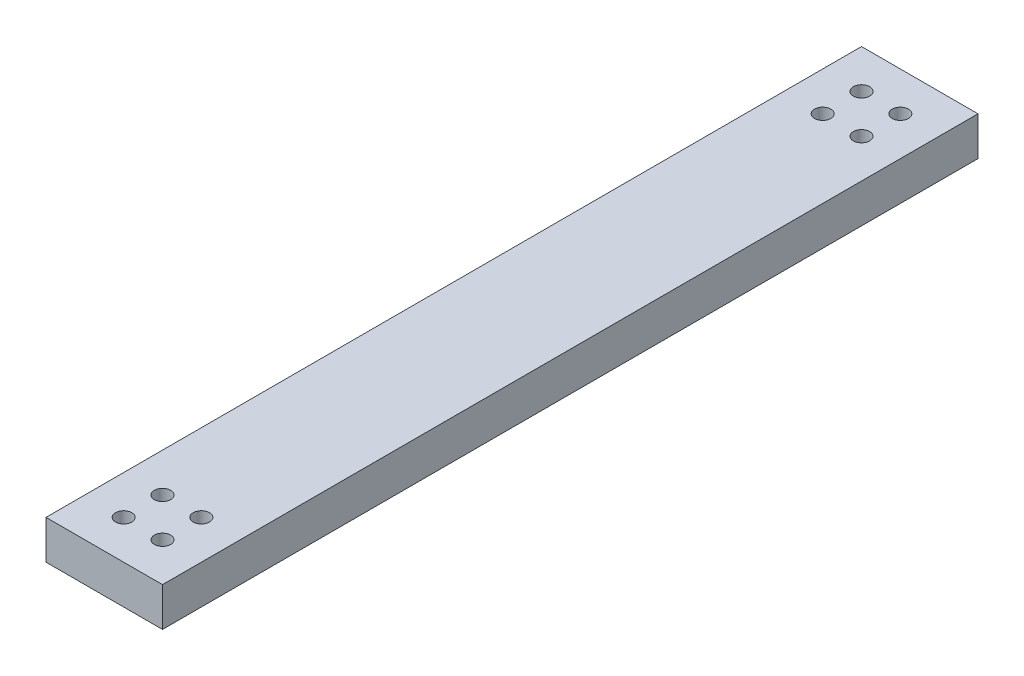
ISO-10303-21;
HEADER;
FILE_DESCRIPTION(('STEP AP214'),'2;1');
FILE_NAME('part.step','',(''),(''),'','','');
FILE_SCHEMA(('AUTOMOTIVE_DESIGN { 1 0 10303 214 1 1 1 1 }'));
ENDSEC;
DATA;
#1=APPLICATION_CONTEXT('core data for automotive mechanical design processes');
#2=APPLICATION_PROTOCOL_DEFINITION('international standard','automotive_design',2000,#1);
#3=PRODUCT_CONTEXT('',#1,'mechanical');
#4=PRODUCT('Part','Part','',(#3));
#5=PRODUCT_RELATED_PRODUCT_CATEGORY('part','',(#4));
#6=PRODUCT_DEFINITION_FORMATION('','',#4);
#7=PRODUCT_DEFINITION_CONTEXT('part definition',#1,'design');
#8=PRODUCT_DEFINITION('design','',#6,#7);
#9=PRODUCT_DEFINITION_SHAPE('','',#8);
#10=(LENGTH_UNIT() NAMED_UNIT(*) SI_UNIT(.MILLI.,.METRE.));
#11=(NAMED_UNIT(*) PLANE_ANGLE_UNIT() SI_UNIT($,.RADIAN.));
#12=(NAMED_UNIT(*) SI_UNIT($,.STERADIAN.) SOLID_ANGLE_UNIT());
#13=UNCERTAINTY_MEASURE_WITH_UNIT(LENGTH_MEASURE(1.E-05),#10,'distance_accuracy_value','');
#14=(GEOMETRIC_REPRESENTATION_CONTEXT(3) GLOBAL_UNCERTAINTY_ASSIGNED_CONTEXT((#13)) GLOBAL_UNIT_ASSIGNED_CONTEXT((#10,
#11,#12)) REPRESENTATION_CONTEXT('',''));
#15=CARTESIAN_POINT('',(0.,0.,0.));
#16=DIRECTION('',(0.,0.,1.));
#17=DIRECTION('',(1.,0.,0.));
#18=AXIS2_PLACEMENT_3D('',#15,#16,#17);
#19=CARTESIAN_POINT('',(0.,10.,0.));
#20=DIRECTION('',(0.,1.,0.));
#21=DIRECTION('',(0.,0.,1.));
#22=AXIS2_PLACEMENT_3D('',#19,#20,#21);
#23=PLANE('',#22);
#24=CARTESIAN_POINT('',(5.,10.,185.));
#25=DIRECTION('',(0.,1.,0.));
#26=DIRECTION('',(0.,0.,1.));
#27=AXIS2_PLACEMENT_3D('',#24,#25,#26);
#28=CIRCLE('',#27,2.1);
#29=CARTESIAN_POINT('',(5.,10.,187.1));
#30=VERTEX_POINT('',#29);
#31=EDGE_CURVE('E147',#30,#30,#28,.T.);
#32=ORIENTED_EDGE('',*,*,#31,.F.);
#33=EDGE_LOOP('',(#32));
#34=FACE_BOUND('',#33,.T.);
#35=CARTESIAN_POINT('',(-4.99999999999998,10.,175.));
#36=DIRECTION('',(0.,1.,0.));
#37=DIRECTION('',(0.,0.,1.));
#38=AXIS2_PLACEMENT_3D('',#35,#36,#37);
#39=CIRCLE('',#38,2.1);
#40=CARTESIAN_POINT('',(-4.99999999999998,10.,177.1));
#41=VERTEX_POINT('',#40);
#42=EDGE_CURVE('E135',#41,#41,#39,.T.);
#43=ORIENTED_EDGE('',*,*,#42,.F.);
#44=EDGE_LOOP('',(#43));
#45=FACE_BOUND('',#44,.T.);
#46=CARTESIAN_POINT('',(-5.,10.,5.));
#47=DIRECTION('',(0.,1.,0.));
#48=DIRECTION('',(0.,0.,1.));
#49=AXIS2_PLACEMENT_3D('',#46,#47,#48);
#50=CIRCLE('',#49,2.1);
#51=CARTESIAN_POINT('',(-5.,10.,7.1));
#52=VERTEX_POINT('',#51);
#53=EDGE_CURVE('E123',#52,#52,#50,.T.);
#54=ORIENTED_EDGE('',*,*,#53,.F.);
#55=EDGE_LOOP('',(#54));
#56=FACE_BOUND('',#55,.T.);
#57=CARTESIAN_POINT('',(-5.,10.,-5.));
#58=DIRECTION('',(0.,1.,0.));
#59=DIRECTION('',(0.,0.,1.));
#60=AXIS2_PLACEMENT_3D('',#57,#58,#59);
#61=CIRCLE('',#60,2.1);
#62=CARTESIAN_POINT('',(-5.,10.,-2.9));
#63=VERTEX_POINT('',#62);
#64=EDGE_CURVE('E102',#63,#63,#61,.T.);
#65=ORIENTED_EDGE('',*,*,#64,.F.);
#66=EDGE_LOOP('',(#65));
#67=FACE_BOUND('',#66,.T.);
#68=DIRECTION('',(0.,0.,1.));
#69=VECTOR('',#68,1.);
#70=CARTESIAN_POINT('',(-15.,10.,-15.));
#71=LINE('',#70,#69);
#72=CARTESIAN_POINT('',(-15.,10.,-15.));
#73=VERTEX_POINT('',#72);
#74=CARTESIAN_POINT('',(-15.,10.,195.));
#75=VERTEX_POINT('',#74);
#76=EDGE_CURVE('E87',#73,#75,#71,.T.);
#77=ORIENTED_EDGE('',*,*,#76,.T.);
#78=DIRECTION('',(1.,0.,0.));
#79=VECTOR('',#78,1.);
#80=CARTESIAN_POINT('',(-15.,10.,195.));
#81=LINE('',#80,#79);
#82=CARTESIAN_POINT('',(15.,10.,195.));
#83=VERTEX_POINT('',#82);
#84=EDGE_CURVE('E82',#75,#83,#81,.T.);
#85=ORIENTED_EDGE('',*,*,#84,.T.);
#86=DIRECTION('',(0.,0.,-1.));
#87=VECTOR('',#86,1.);
#88=CARTESIAN_POINT('',(15.,10.,-15.));
#89=LINE('',#88,#87);
#90=CARTESIAN_POINT('',(15.,10.,-15.));
#91=VERTEX_POINT('',#90);
#92=EDGE_CURVE('E85',#83,#91,#89,.T.);
#93=ORIENTED_EDGE('',*,*,#92,.T.);
#94=DIRECTION('',(-1.,0.,0.));
#95=VECTOR('',#94,1.);
#96=CARTESIAN_POINT('',(15.,10.,-15.));
#97=LINE('',#96,#95);
#98=EDGE_CURVE('E52',#91,#73,#97,.T.);
#99=ORIENTED_EDGE('',*,*,#98,.T.);
#100=EDGE_LOOP('',(#77,#85,#93,#99));
#101=FACE_BOUND('',#100,.T.);
#102=CARTESIAN_POINT('',(5.,10.,-5.));
#103=DIRECTION('',(0.,1.,0.));
#104=DIRECTION('',(0.,0.,1.));
#105=AXIS2_PLACEMENT_3D('',#102,#103,#104);
#106=CIRCLE('',#105,2.1);
#107=CARTESIAN_POINT('',(5.,10.,-2.9));
#108=VERTEX_POINT('',#107);
#109=EDGE_CURVE('E117',#108,#108,#106,.T.);
#110=ORIENTED_EDGE('',*,*,#109,.F.);
#111=EDGE_LOOP('',(#110));
#112=FACE_BOUND('',#111,.T.);
#113=CARTESIAN_POINT('',(5.,10.,5.));
#114=DIRECTION('',(0.,1.,0.));
#115=DIRECTION('',(0.,0.,1.));
#116=AXIS2_PLACEMENT_3D('',#113,#114,#115);
#117=CIRCLE('',#116,2.1);
#118=CARTESIAN_POINT('',(5.,10.,7.1));
#119=VERTEX_POINT('',#118);
#120=EDGE_CURVE('E129',#119,#119,#117,.T.);
#121=ORIENTED_EDGE('',*,*,#120,.F.);
#122=EDGE_LOOP('',(#121));
#123=FACE_BOUND('',#122,.T.);
#124=CARTESIAN_POINT('',(5.,10.,175.));
#125=DIRECTION('',(0.,1.,0.));
#126=DIRECTION('',(0.,0.,1.));
#127=AXIS2_PLACEMENT_3D('',#124,#125,#126);
#128=CIRCLE('',#127,2.1);
#129=CARTESIAN_POINT('',(5.,10.,177.1));
#130=VERTEX_POINT('',#129);
#131=EDGE_CURVE('E141',#130,#130,#128,.T.);
#132=ORIENTED_EDGE('',*,*,#131,.F.);
#133=EDGE_LOOP('',(#132));
#134=FACE_BOUND('',#133,.T.);
#135=CARTESIAN_POINT('',(-4.99999999999998,10.,185.));
#136=DIRECTION('',(0.,1.,0.));
#137=DIRECTION('',(0.,0.,1.));
#138=AXIS2_PLACEMENT_3D('',#135,#136,#137);
#139=CIRCLE('',#138,2.1);
#140=CARTESIAN_POINT('',(-4.99999999999998,10.,187.1));
#141=VERTEX_POINT('',#140);
#142=EDGE_CURVE('E153',#141,#141,#139,.T.);
#143=ORIENTED_EDGE('',*,*,#142,.F.);
#144=EDGE_LOOP('',(#143));
#145=FACE_BOUND('',#144,.T.);
#146=ADVANCED_FACE('F35',(#34,#45,#56,#67,#101,#112,#123,#134,#145),#23,.T.);
#147=CARTESIAN_POINT('',(0.,0.,0.));
#148=DIRECTION('',(0.,1.,0.));
#149=DIRECTION('',(0.,0.,1.));
#150=AXIS2_PLACEMENT_3D('',#147,#148,#149);
#151=PLANE('',#150);
#152=DIRECTION('',(0.,0.,1.));
#153=VECTOR('',#152,1.);
#154=CARTESIAN_POINT('',(-15.,0.,-15.));
#155=LINE('',#154,#153);
#156=CARTESIAN_POINT('',(-15.,0.,-15.));
#157=VERTEX_POINT('',#156);
#158=CARTESIAN_POINT('',(-15.,0.,195.));
#159=VERTEX_POINT('',#158);
#160=EDGE_CURVE('E99',#157,#159,#155,.T.);
#161=ORIENTED_EDGE('',*,*,#160,.F.);
#162=DIRECTION('',(-1.,0.,0.));
#163=VECTOR('',#162,1.);
#164=CARTESIAN_POINT('',(15.,0.,-15.));
#165=LINE('',#164,#163);
#166=CARTESIAN_POINT('',(15.,0.,-15.));
#167=VERTEX_POINT('',#166);
#168=EDGE_CURVE('E75',#167,#157,#165,.T.);
#169=ORIENTED_EDGE('',*,*,#168,.F.);
#170=DIRECTION('',(0.,0.,-1.));
#171=VECTOR('',#170,1.);
#172=CARTESIAN_POINT('',(15.,0.,-15.));
#173=LINE('',#172,#171);
#174=CARTESIAN_POINT('',(15.,0.,195.));
#175=VERTEX_POINT('',#174);
#176=EDGE_CURVE('E69',#175,#167,#173,.T.);
#177=ORIENTED_EDGE('',*,*,#176,.F.);
#178=DIRECTION('',(1.,0.,0.));
#179=VECTOR('',#178,1.);
#180=CARTESIAN_POINT('',(-15.,0.,195.));
#181=LINE('',#180,#179);
#182=EDGE_CURVE('E91',#159,#175,#181,.T.);
#183=ORIENTED_EDGE('',*,*,#182,.F.);
#184=EDGE_LOOP('',(#161,#169,#177,#183));
#185=FACE_BOUND('',#184,.T.);
#186=CARTESIAN_POINT('',(-5.,0.,-5.));
#187=DIRECTION('',(0.,1.,0.));
#188=DIRECTION('',(0.,0.,1.));
#189=AXIS2_PLACEMENT_3D('',#186,#187,#188);
#190=CIRCLE('',#189,2.1);
#191=CARTESIAN_POINT('',(-5.,0.,-2.9));
#192=VERTEX_POINT('',#191);
#193=EDGE_CURVE('E114',#192,#192,#190,.T.);
#194=ORIENTED_EDGE('',*,*,#193,.T.);
#195=EDGE_LOOP('',(#194));
#196=FACE_BOUND('',#195,.T.);
#197=CARTESIAN_POINT('',(5.,0.,-5.));
#198=DIRECTION('',(0.,1.,0.));
#199=DIRECTION('',(0.,0.,1.));
#200=AXIS2_PLACEMENT_3D('',#197,#198,#199);
#201=CIRCLE('',#200,2.1);
#202=CARTESIAN_POINT('',(5.,0.,-2.9));
#203=VERTEX_POINT('',#202);
#204=EDGE_CURVE('E120',#203,#203,#201,.T.);
#205=ORIENTED_EDGE('',*,*,#204,.T.);
#206=EDGE_LOOP('',(#205));
#207=FACE_BOUND('',#206,.T.);
#208=CARTESIAN_POINT('',(-5.,0.,5.));
#209=DIRECTION('',(0.,1.,0.));
#210=DIRECTION('',(0.,0.,1.));
#211=AXIS2_PLACEMENT_3D('',#208,#209,#210);
#212=CIRCLE('',#211,2.1);
#213=CARTESIAN_POINT('',(-5.,0.,7.1));
#214=VERTEX_POINT('',#213);
#215=EDGE_CURVE('E126',#214,#214,#212,.T.);
#216=ORIENTED_EDGE('',*,*,#215,.T.);
#217=EDGE_LOOP('',(#216));
#218=FACE_BOUND('',#217,.T.);
#219=CARTESIAN_POINT('',(5.,0.,5.));
#220=DIRECTION('',(0.,1.,0.));
#221=DIRECTION('',(0.,0.,1.));
#222=AXIS2_PLACEMENT_3D('',#219,#220,#221);
#223=CIRCLE('',#222,2.1);
#224=CARTESIAN_POINT('',(5.,0.,7.1));
#225=VERTEX_POINT('',#224);
#226=EDGE_CURVE('E132',#225,#225,#223,.T.);
#227=ORIENTED_EDGE('',*,*,#226,.T.);
#228=EDGE_LOOP('',(#227));
#229=FACE_BOUND('',#228,.T.);
#230=CARTESIAN_POINT('',(-4.99999999999998,0.,175.));
#231=DIRECTION('',(0.,1.,0.));
#232=DIRECTION('',(0.,0.,1.));
#233=AXIS2_PLACEMENT_3D('',#230,#231,#232);
#234=CIRCLE('',#233,2.1);
#235=CARTESIAN_POINT('',(-4.99999999999998,0.,177.1));
#236=VERTEX_POINT('',#235);
#237=EDGE_CURVE('E138',#236,#236,#234,.T.);
#238=ORIENTED_EDGE('',*,*,#237,.T.);
#239=EDGE_LOOP('',(#238));
#240=FACE_BOUND('',#239,.T.);
#241=CARTESIAN_POINT('',(5.,0.,175.));
#242=DIRECTION('',(0.,1.,0.));
#243=DIRECTION('',(0.,0.,1.));
#244=AXIS2_PLACEMENT_3D('',#241,#242,#243);
#245=CIRCLE('',#244,2.1);
#246=CARTESIAN_POINT('',(5.,0.,177.1));
#247=VERTEX_POINT('',#246);
#248=EDGE_CURVE('E144',#247,#247,#245,.T.);
#249=ORIENTED_EDGE('',*,*,#248,.T.);
#250=EDGE_LOOP('',(#249));
#251=FACE_BOUND('',#250,.T.);
#252=CARTESIAN_POINT('',(5.,0.,185.));
#253=DIRECTION('',(0.,1.,0.));
#254=DIRECTION('',(0.,0.,1.));
#255=AXIS2_PLACEMENT_3D('',#252,#253,#254);
#256=CIRCLE('',#255,2.1);
#257=CARTESIAN_POINT('',(5.,0.,187.1));
#258=VERTEX_POINT('',#257);
#259=EDGE_CURVE('E150',#258,#258,#256,.T.);
#260=ORIENTED_EDGE('',*,*,#259,.T.);
#261=EDGE_LOOP('',(#260));
#262=FACE_BOUND('',#261,.T.);
#263=CARTESIAN_POINT('',(-4.99999999999998,0.,185.));
#264=DIRECTION('',(0.,1.,0.));
#265=DIRECTION('',(0.,0.,1.));
#266=AXIS2_PLACEMENT_3D('',#263,#264,#265);
#267=CIRCLE('',#266,2.1);
#268=CARTESIAN_POINT('',(-4.99999999999998,0.,187.1));
#269=VERTEX_POINT('',#268);
#270=EDGE_CURVE('E156',#269,#269,#267,.T.);
#271=ORIENTED_EDGE('',*,*,#270,.T.);
#272=EDGE_LOOP('',(#271));
#273=FACE_BOUND('',#272,.T.);
#274=ADVANCED_FACE('F110',(#185,#196,#207,#218,#229,#240,#251,#262,#273),#151,.F.);
#275=CARTESIAN_POINT('',(-15.,10.,-15.));
#276=DIRECTION('',(1.,0.,0.));
#277=DIRECTION('',(0.,0.,-1.));
#278=AXIS2_PLACEMENT_3D('',#275,#276,#277);
#279=PLANE('',#278);
#280=ORIENTED_EDGE('',*,*,#160,.T.);
#281=DIRECTION('',(0.,-1.,0.));
#282=VECTOR('',#281,1.);
#283=CARTESIAN_POINT('',(-15.,10.,195.));
#284=LINE('',#283,#282);
#285=EDGE_CURVE('E11',#75,#159,#284,.T.);
#286=ORIENTED_EDGE('',*,*,#285,.F.);
#287=ORIENTED_EDGE('',*,*,#76,.F.);
#288=DIRECTION('',(0.,-1.,0.));
#289=VECTOR('',#288,1.);
#290=CARTESIAN_POINT('',(-15.,10.,-15.));
#291=LINE('',#290,#289);
#292=EDGE_CURVE('E95',#73,#157,#291,.T.);
#293=ORIENTED_EDGE('',*,*,#292,.T.);
#294=EDGE_LOOP('',(#280,#286,#287,#293));
#295=FACE_BOUND('',#294,.T.);
#296=ADVANCED_FACE('F37',(#295),#279,.F.);
#297=CARTESIAN_POINT('',(-15.,10.,195.));
#298=DIRECTION('',(0.,0.,-1.));
#299=DIRECTION('',(-1.,0.,0.));
#300=AXIS2_PLACEMENT_3D('',#297,#298,#299);
#301=PLANE('',#300);
#302=ORIENTED_EDGE('',*,*,#182,.T.);
#303=DIRECTION('',(0.,-1.,0.));
#304=VECTOR('',#303,1.);
#305=CARTESIAN_POINT('',(15.,10.,195.));
#306=LINE('',#305,#304);
#307=EDGE_CURVE('E44',#83,#175,#306,.T.);
#308=ORIENTED_EDGE('',*,*,#307,.F.);
#309=ORIENTED_EDGE('',*,*,#84,.F.);
#310=ORIENTED_EDGE('',*,*,#285,.T.);
#311=EDGE_LOOP('',(#302,#308,#309,#310));
#312=FACE_BOUND('',#311,.T.);
#313=ADVANCED_FACE('F90',(#312),#301,.F.);
#314=CARTESIAN_POINT('',(15.,10.,-15.));
#315=DIRECTION('',(-1.,0.,0.));
#316=DIRECTION('',(0.,0.,1.));
#317=AXIS2_PLACEMENT_3D('',#314,#315,#316);
#318=PLANE('',#317);
#319=ORIENTED_EDGE('',*,*,#176,.T.);
#320=DIRECTION('',(0.,-1.,0.));
#321=VECTOR('',#320,1.);
#322=CARTESIAN_POINT('',(15.,10.,-15.));
#323=LINE('',#322,#321);
#324=EDGE_CURVE('E92',#91,#167,#323,.T.);
#325=ORIENTED_EDGE('',*,*,#324,.F.);
#326=ORIENTED_EDGE('',*,*,#92,.F.);
#327=ORIENTED_EDGE('',*,*,#307,.T.);
#328=EDGE_LOOP('',(#319,#325,#326,#327));
#329=FACE_BOUND('',#328,.T.);
#330=ADVANCED_FACE('F93',(#329),#318,.F.);
#331=CARTESIAN_POINT('',(15.,10.,-15.));
#332=DIRECTION('',(0.,0.,1.));
#333=DIRECTION('',(1.,0.,0.));
#334=AXIS2_PLACEMENT_3D('',#331,#332,#333);
#335=PLANE('',#334);
#336=ORIENTED_EDGE('',*,*,#168,.T.);
#337=ORIENTED_EDGE('',*,*,#292,.F.);
#338=ORIENTED_EDGE('',*,*,#98,.F.);
#339=ORIENTED_EDGE('',*,*,#324,.T.);
#340=EDGE_LOOP('',(#336,#337,#338,#339));
#341=FACE_BOUND('',#340,.T.);
#342=ADVANCED_FACE('F107',(#341),#335,.F.);
#343=CARTESIAN_POINT('',(-5.,10.,-5.));
#344=DIRECTION('',(0.,-1.,0.));
#345=DIRECTION('',(0.,0.,-1.));
#346=AXIS2_PLACEMENT_3D('',#343,#344,#345);
#347=CYLINDRICAL_SURFACE('',#346,2.1);
#348=ORIENTED_EDGE('',*,*,#64,.T.);
#349=EDGE_LOOP('',(#348));
#350=FACE_BOUND('',#349,.T.);
#351=ORIENTED_EDGE('',*,*,#193,.F.);
#352=EDGE_LOOP('',(#351));
#353=FACE_BOUND('',#352,.T.);
#354=ADVANCED_FACE('F175',(#350,#353),#347,.F.);
#355=CARTESIAN_POINT('',(5.,10.,-5.));
#356=DIRECTION('',(0.,-1.,0.));
#357=DIRECTION('',(0.,0.,-1.));
#358=AXIS2_PLACEMENT_3D('',#355,#356,#357);
#359=CYLINDRICAL_SURFACE('',#358,2.1);
#360=ORIENTED_EDGE('',*,*,#109,.T.);
#361=EDGE_LOOP('',(#360));
#362=FACE_BOUND('',#361,.T.);
#363=ORIENTED_EDGE('',*,*,#204,.F.);
#364=EDGE_LOOP('',(#363));
#365=FACE_BOUND('',#364,.T.);
#366=ADVANCED_FACE('F221',(#362,#365),#359,.F.);
#367=CARTESIAN_POINT('',(-5.,10.,5.));
#368=DIRECTION('',(0.,-1.,0.));
#369=DIRECTION('',(0.,0.,-1.));
#370=AXIS2_PLACEMENT_3D('',#367,#368,#369);
#371=CYLINDRICAL_SURFACE('',#370,2.1);
#372=ORIENTED_EDGE('',*,*,#53,.T.);
#373=EDGE_LOOP('',(#372));
#374=FACE_BOUND('',#373,.T.);
#375=ORIENTED_EDGE('',*,*,#215,.F.);
#376=EDGE_LOOP('',(#375));
#377=FACE_BOUND('',#376,.T.);
#378=ADVANCED_FACE('F229',(#374,#377),#371,.F.);
#379=CARTESIAN_POINT('',(5.,10.,5.));
#380=DIRECTION('',(0.,-1.,0.));
#381=DIRECTION('',(0.,0.,-1.));
#382=AXIS2_PLACEMENT_3D('',#379,#380,#381);
#383=CYLINDRICAL_SURFACE('',#382,2.1);
#384=ORIENTED_EDGE('',*,*,#120,.T.);
#385=EDGE_LOOP('',(#384));
#386=FACE_BOUND('',#385,.T.);
#387=ORIENTED_EDGE('',*,*,#226,.F.);
#388=EDGE_LOOP('',(#387));
#389=FACE_BOUND('',#388,.T.);
#390=ADVANCED_FACE('F237',(#386,#389),#383,.F.);
#391=CARTESIAN_POINT('',(-4.99999999999998,10.,175.));
#392=DIRECTION('',(0.,-1.,0.));
#393=DIRECTION('',(0.,0.,-1.));
#394=AXIS2_PLACEMENT_3D('',#391,#392,#393);
#395=CYLINDRICAL_SURFACE('',#394,2.1);
#396=ORIENTED_EDGE('',*,*,#42,.T.);
#397=EDGE_LOOP('',(#396));
#398=FACE_BOUND('',#397,.T.);
#399=ORIENTED_EDGE('',*,*,#237,.F.);
#400=EDGE_LOOP('',(#399));
#401=FACE_BOUND('',#400,.T.);
#402=ADVANCED_FACE('F246',(#398,#401),#395,.F.);
#403=CARTESIAN_POINT('',(5.,10.,175.));
#404=DIRECTION('',(0.,-1.,0.));
#405=DIRECTION('',(0.,0.,-1.));
#406=AXIS2_PLACEMENT_3D('',#403,#404,#405);
#407=CYLINDRICAL_SURFACE('',#406,2.1);
#408=ORIENTED_EDGE('',*,*,#131,.T.);
#409=EDGE_LOOP('',(#408));
#410=FACE_BOUND('',#409,.T.);
#411=ORIENTED_EDGE('',*,*,#248,.F.);
#412=EDGE_LOOP('',(#411));
#413=FACE_BOUND('',#412,.T.);
#414=ADVANCED_FACE('F255',(#410,#413),#407,.F.);
#415=CARTESIAN_POINT('',(5.,10.,185.));
#416=DIRECTION('',(0.,-1.,0.));
#417=DIRECTION('',(0.,0.,-1.));
#418=AXIS2_PLACEMENT_3D('',#415,#416,#417);
#419=CYLINDRICAL_SURFACE('',#418,2.1);
#420=ORIENTED_EDGE('',*,*,#31,.T.);
#421=EDGE_LOOP('',(#420));
#422=FACE_BOUND('',#421,.T.);
#423=ORIENTED_EDGE('',*,*,#259,.F.);
#424=EDGE_LOOP('',(#423));
#425=FACE_BOUND('',#424,.T.);
#426=ADVANCED_FACE('F264',(#422,#425),#419,.F.);
#427=CARTESIAN_POINT('',(-4.99999999999998,10.,185.));
#428=DIRECTION('',(0.,-1.,0.));
#429=DIRECTION('',(0.,0.,-1.));
#430=AXIS2_PLACEMENT_3D('',#427,#428,#429);
#431=CYLINDRICAL_SURFACE('',#430,2.1);
#432=ORIENTED_EDGE('',*,*,#142,.T.);
#433=EDGE_LOOP('',(#432));
#434=FACE_BOUND('',#433,.T.);
#435=ORIENTED_EDGE('',*,*,#270,.F.);
#436=EDGE_LOOP('',(#435));
#437=FACE_BOUND('',#436,.T.);
#438=ADVANCED_FACE('F162',(#434,#437),#431,.F.);
#439=CLOSED_SHELL('',(#146,#274,#296,#313,#330,#342,#354,#366,#378,#390,#402,#414,#426,#438));
#440=MANIFOLD_SOLID_BREP('B2',#439);
#441=ADVANCED_BREP_SHAPE_REPRESENTATION('',(#18,#440),#14);
#442=SHAPE_DEFINITION_REPRESENTATION(#9,#441);
ENDSEC;
END-ISO-10303-21;
